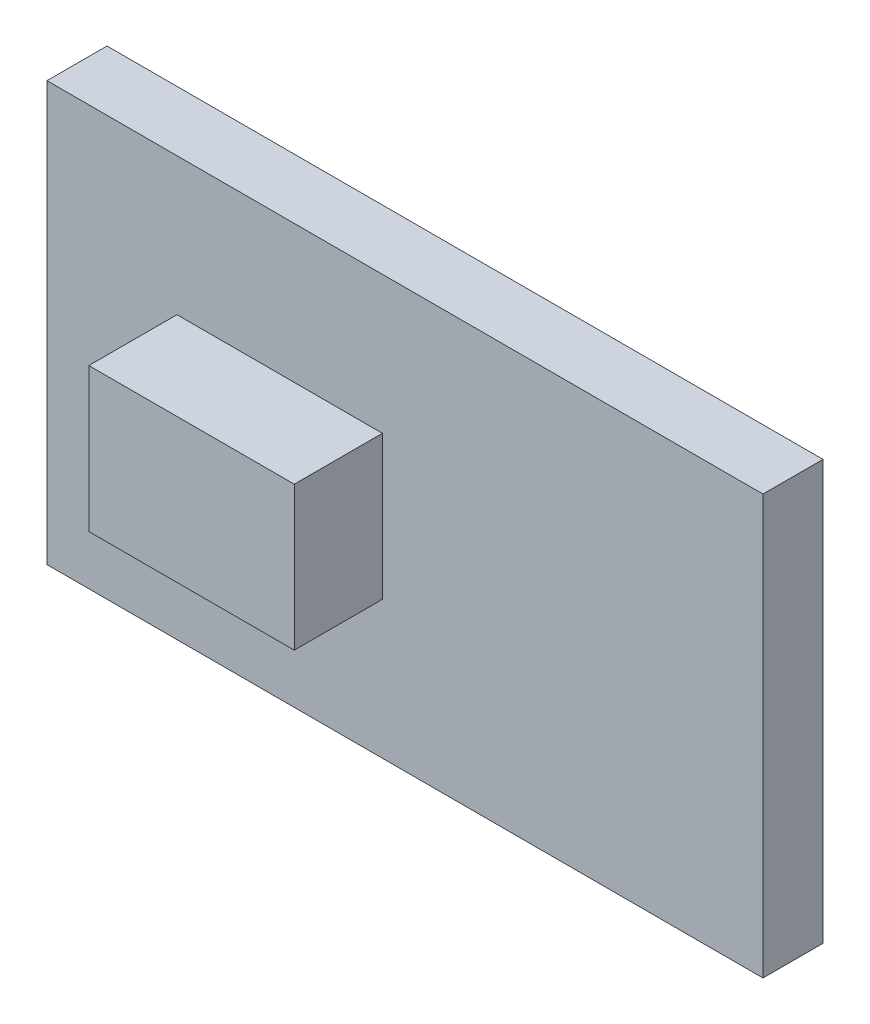
ISO-10303-21;
HEADER;
FILE_DESCRIPTION(('STEP AP214'),'2;1');
FILE_NAME('part.step','',(''),(''),'','','');
FILE_SCHEMA(('AUTOMOTIVE_DESIGN { 1 0 10303 214 1 1 1 1 }'));
ENDSEC;
DATA;
#1=APPLICATION_CONTEXT('core data for automotive mechanical design processes');
#2=APPLICATION_PROTOCOL_DEFINITION('international standard','automotive_design',2000,#1);
#3=PRODUCT_CONTEXT('',#1,'mechanical');
#4=PRODUCT('Part','Part','',(#3));
#5=PRODUCT_RELATED_PRODUCT_CATEGORY('part','',(#4));
#6=PRODUCT_DEFINITION_FORMATION('','',#4);
#7=PRODUCT_DEFINITION_CONTEXT('part definition',#1,'design');
#8=PRODUCT_DEFINITION('design','',#6,#7);
#9=PRODUCT_DEFINITION_SHAPE('','',#8);
#10=(LENGTH_UNIT() NAMED_UNIT(*) SI_UNIT(.MILLI.,.METRE.));
#11=(NAMED_UNIT(*) PLANE_ANGLE_UNIT() SI_UNIT($,.RADIAN.));
#12=(NAMED_UNIT(*) SI_UNIT($,.STERADIAN.) SOLID_ANGLE_UNIT());
#13=UNCERTAINTY_MEASURE_WITH_UNIT(LENGTH_MEASURE(1.E-05),#10,'distance_accuracy_value','');
#14=(GEOMETRIC_REPRESENTATION_CONTEXT(3) GLOBAL_UNCERTAINTY_ASSIGNED_CONTEXT((#13)) GLOBAL_UNIT_ASSIGNED_CONTEXT((#10,
#11,#12)) REPRESENTATION_CONTEXT('',''));
#15=CARTESIAN_POINT('',(0.,0.,0.));
#16=DIRECTION('',(0.,0.,1.));
#17=DIRECTION('',(1.,0.,0.));
#18=AXIS2_PLACEMENT_3D('',#15,#16,#17);
#19=CARTESIAN_POINT('',(-29.2958267155257,7.61,1.09));
#20=DIRECTION('',(0.,0.,-1.));
#21=DIRECTION('',(-1.,0.,0.));
#22=AXIS2_PLACEMENT_3D('',#19,#20,#21);
#23=PLANE('',#22);
#24=DIRECTION('',(0.,-1.,0.));
#25=VECTOR('',#24,1.);
#26=CARTESIAN_POINT('',(-29.2958267155257,0.,1.09));
#27=LINE('',#26,#25);
#28=CARTESIAN_POINT('',(-29.2958267155257,7.61,1.09));
#29=VERTEX_POINT('',#28);
#30=CARTESIAN_POINT('',(-29.2958267155257,0.,1.09));
#31=VERTEX_POINT('',#30);
#32=EDGE_CURVE('E129',#29,#31,#27,.T.);
#33=ORIENTED_EDGE('',*,*,#32,.T.);
#34=DIRECTION('',(1.,0.,0.));
#35=VECTOR('',#34,1.);
#36=CARTESIAN_POINT('',(-16.2958267155257,0.,1.09));
#37=LINE('',#36,#35);
#38=CARTESIAN_POINT('',(-16.2958267155257,0.,1.09));
#39=VERTEX_POINT('',#38);
#40=EDGE_CURVE('E132',#31,#39,#37,.T.);
#41=ORIENTED_EDGE('',*,*,#40,.T.);
#42=DIRECTION('',(0.,1.,0.));
#43=VECTOR('',#42,1.);
#44=CARTESIAN_POINT('',(-16.2958267155257,7.61,1.09));
#45=LINE('',#44,#43);
#46=CARTESIAN_POINT('',(-16.2958267155257,7.61,1.09));
#47=VERTEX_POINT('',#46);
#48=EDGE_CURVE('E135',#39,#47,#45,.T.);
#49=ORIENTED_EDGE('',*,*,#48,.T.);
#50=DIRECTION('',(-1.,0.,0.));
#51=VECTOR('',#50,1.);
#52=CARTESIAN_POINT('',(-29.2958267155257,7.61,1.09));
#53=LINE('',#52,#51);
#54=EDGE_CURVE('E137',#47,#29,#53,.T.);
#55=ORIENTED_EDGE('',*,*,#54,.T.);
#56=EDGE_LOOP('',(#33,#41,#49,#55));
#57=FACE_BOUND('',#56,.T.);
#58=DIRECTION('',(0.,-1.,0.));
#59=VECTOR('',#58,1.);
#60=CARTESIAN_POINT('',(-26.9358267155257,2.5,1.09));
#61=LINE('',#60,#59);
#62=CARTESIAN_POINT('',(-26.9358267155257,5.11,1.09));
#63=VERTEX_POINT('',#62);
#64=CARTESIAN_POINT('',(-26.9358267155257,2.5,1.09));
#65=VERTEX_POINT('',#64);
#66=EDGE_CURVE('E119',#63,#65,#61,.T.);
#67=ORIENTED_EDGE('',*,*,#66,.F.);
#68=DIRECTION('',(-1.,0.,0.));
#69=VECTOR('',#68,1.);
#70=CARTESIAN_POINT('',(-26.9358267155257,5.11,1.09));
#71=LINE('',#70,#69);
#72=CARTESIAN_POINT('',(-23.2058267155257,5.11,1.09));
#73=VERTEX_POINT('',#72);
#74=EDGE_CURVE('E116',#73,#63,#71,.T.);
#75=ORIENTED_EDGE('',*,*,#74,.F.);
#76=DIRECTION('',(0.,1.,0.));
#77=VECTOR('',#76,1.);
#78=CARTESIAN_POINT('',(-23.2058267155257,5.11,1.09));
#79=LINE('',#78,#77);
#80=CARTESIAN_POINT('',(-23.2058267155257,2.5,1.09));
#81=VERTEX_POINT('',#80);
#82=EDGE_CURVE('E54',#81,#73,#79,.T.);
#83=ORIENTED_EDGE('',*,*,#82,.F.);
#84=DIRECTION('',(1.,0.,0.));
#85=VECTOR('',#84,1.);
#86=CARTESIAN_POINT('',(-23.2058267155257,2.5,1.09));
#87=LINE('',#86,#85);
#88=EDGE_CURVE('E49',#65,#81,#87,.T.);
#89=ORIENTED_EDGE('',*,*,#88,.F.);
#90=EDGE_LOOP('',(#67,#75,#83,#89));
#91=FACE_BOUND('',#90,.T.);
#92=ADVANCED_FACE('F34',(#57,#91),#23,.F.);
#93=CARTESIAN_POINT('',(-29.2958267155257,0.,1.09));
#94=DIRECTION('',(1.,0.,0.));
#95=DIRECTION('',(0.,0.,-1.));
#96=AXIS2_PLACEMENT_3D('',#93,#94,#95);
#97=PLANE('',#96);
#98=DIRECTION('',(0.,-1.,0.));
#99=VECTOR('',#98,1.);
#100=CARTESIAN_POINT('',(-29.2958267155257,0.,0.));
#101=LINE('',#100,#99);
#102=CARTESIAN_POINT('',(-29.2958267155257,7.61,0.));
#103=VERTEX_POINT('',#102);
#104=CARTESIAN_POINT('',(-29.2958267155257,0.,0.));
#105=VERTEX_POINT('',#104);
#106=EDGE_CURVE('E120',#103,#105,#101,.T.);
#107=ORIENTED_EDGE('',*,*,#106,.T.);
#108=DIRECTION('',(0.,0.,-1.));
#109=VECTOR('',#108,1.);
#110=CARTESIAN_POINT('',(-29.2958267155257,0.,1.09));
#111=LINE('',#110,#109);
#112=EDGE_CURVE('E11',#31,#105,#111,.T.);
#113=ORIENTED_EDGE('',*,*,#112,.F.);
#114=ORIENTED_EDGE('',*,*,#32,.F.);
#115=DIRECTION('',(0.,0.,-1.));
#116=VECTOR('',#115,1.);
#117=CARTESIAN_POINT('',(-29.2958267155257,7.61,1.09));
#118=LINE('',#117,#116);
#119=EDGE_CURVE('E138',#29,#103,#118,.T.);
#120=ORIENTED_EDGE('',*,*,#119,.T.);
#121=EDGE_LOOP('',(#107,#113,#114,#120));
#122=FACE_BOUND('',#121,.T.);
#123=ADVANCED_FACE('F36',(#122),#97,.F.);
#124=CARTESIAN_POINT('',(-16.2958267155257,0.,1.09));
#125=DIRECTION('',(0.,1.,0.));
#126=DIRECTION('',(0.,0.,1.));
#127=AXIS2_PLACEMENT_3D('',#124,#125,#126);
#128=PLANE('',#127);
#129=DIRECTION('',(1.,0.,0.));
#130=VECTOR('',#129,1.);
#131=CARTESIAN_POINT('',(-16.2958267155257,0.,0.));
#132=LINE('',#131,#130);
#133=CARTESIAN_POINT('',(-16.2958267155257,0.,0.));
#134=VERTEX_POINT('',#133);
#135=EDGE_CURVE('E123',#105,#134,#132,.T.);
#136=ORIENTED_EDGE('',*,*,#135,.T.);
#137=DIRECTION('',(0.,0.,-1.));
#138=VECTOR('',#137,1.);
#139=CARTESIAN_POINT('',(-16.2958267155257,0.,1.09));
#140=LINE('',#139,#138);
#141=EDGE_CURVE('E42',#39,#134,#140,.T.);
#142=ORIENTED_EDGE('',*,*,#141,.F.);
#143=ORIENTED_EDGE('',*,*,#40,.F.);
#144=ORIENTED_EDGE('',*,*,#112,.T.);
#145=EDGE_LOOP('',(#136,#142,#143,#144));
#146=FACE_BOUND('',#145,.T.);
#147=ADVANCED_FACE('F168',(#146),#128,.F.);
#148=CARTESIAN_POINT('',(-16.2958267155257,7.61,1.09));
#149=DIRECTION('',(-1.,0.,0.));
#150=DIRECTION('',(0.,0.,1.));
#151=AXIS2_PLACEMENT_3D('',#148,#149,#150);
#152=PLANE('',#151);
#153=DIRECTION('',(0.,1.,0.));
#154=VECTOR('',#153,1.);
#155=CARTESIAN_POINT('',(-16.2958267155257,7.61,0.));
#156=LINE('',#155,#154);
#157=CARTESIAN_POINT('',(-16.2958267155257,7.61,0.));
#158=VERTEX_POINT('',#157);
#159=EDGE_CURVE('E141',#134,#158,#156,.T.);
#160=ORIENTED_EDGE('',*,*,#159,.T.);
#161=DIRECTION('',(0.,0.,-1.));
#162=VECTOR('',#161,1.);
#163=CARTESIAN_POINT('',(-16.2958267155257,7.61,1.09));
#164=LINE('',#163,#162);
#165=EDGE_CURVE('E146',#47,#158,#164,.T.);
#166=ORIENTED_EDGE('',*,*,#165,.F.);
#167=ORIENTED_EDGE('',*,*,#48,.F.);
#168=ORIENTED_EDGE('',*,*,#141,.T.);
#169=EDGE_LOOP('',(#160,#166,#167,#168));
#170=FACE_BOUND('',#169,.T.);
#171=ADVANCED_FACE('F153',(#170),#152,.F.);
#172=CARTESIAN_POINT('',(-29.2958267155257,7.61,1.09));
#173=DIRECTION('',(0.,-1.,0.));
#174=DIRECTION('',(0.,0.,-1.));
#175=AXIS2_PLACEMENT_3D('',#172,#173,#174);
#176=PLANE('',#175);
#177=DIRECTION('',(-1.,0.,0.));
#178=VECTOR('',#177,1.);
#179=CARTESIAN_POINT('',(-29.2958267155257,7.61,0.));
#180=LINE('',#179,#178);
#181=EDGE_CURVE('E133',#158,#103,#180,.T.);
#182=ORIENTED_EDGE('',*,*,#181,.T.);
#183=ORIENTED_EDGE('',*,*,#119,.F.);
#184=ORIENTED_EDGE('',*,*,#54,.F.);
#185=ORIENTED_EDGE('',*,*,#165,.T.);
#186=EDGE_LOOP('',(#182,#183,#184,#185));
#187=FACE_BOUND('',#186,.T.);
#188=ADVANCED_FACE('F162',(#187),#176,.F.);
#189=CARTESIAN_POINT('',(-29.2958267155257,7.61,0.));
#190=DIRECTION('',(0.,0.,-1.));
#191=DIRECTION('',(-1.,0.,0.));
#192=AXIS2_PLACEMENT_3D('',#189,#190,#191);
#193=PLANE('',#192);
#194=ORIENTED_EDGE('',*,*,#106,.F.);
#195=ORIENTED_EDGE('',*,*,#181,.F.);
#196=ORIENTED_EDGE('',*,*,#159,.F.);
#197=ORIENTED_EDGE('',*,*,#135,.F.);
#198=EDGE_LOOP('',(#194,#195,#196,#197));
#199=FACE_BOUND('',#198,.T.);
#200=ADVANCED_FACE('F159',(#199),#193,.T.);
#201=CARTESIAN_POINT('',(-26.9358267155257,2.5,2.69));
#202=DIRECTION('',(1.,0.,0.));
#203=DIRECTION('',(0.,0.,-1.));
#204=AXIS2_PLACEMENT_3D('',#201,#202,#203);
#205=PLANE('',#204);
#206=ORIENTED_EDGE('',*,*,#66,.T.);
#207=DIRECTION('',(0.,0.,-1.));
#208=VECTOR('',#207,1.);
#209=CARTESIAN_POINT('',(-26.9358267155257,2.5,2.69));
#210=LINE('',#209,#208);
#211=CARTESIAN_POINT('',(-26.9358267155257,2.5,2.69));
#212=VERTEX_POINT('',#211);
#213=EDGE_CURVE('E100',#212,#65,#210,.T.);
#214=ORIENTED_EDGE('',*,*,#213,.F.);
#215=DIRECTION('',(0.,-1.,0.));
#216=VECTOR('',#215,1.);
#217=CARTESIAN_POINT('',(-26.9358267155257,2.5,2.69));
#218=LINE('',#217,#216);
#219=CARTESIAN_POINT('',(-26.9358267155257,5.11,2.69));
#220=VERTEX_POINT('',#219);
#221=EDGE_CURVE('E107',#220,#212,#218,.T.);
#222=ORIENTED_EDGE('',*,*,#221,.F.);
#223=DIRECTION('',(0.,0.,-1.));
#224=VECTOR('',#223,1.);
#225=CARTESIAN_POINT('',(-26.9358267155257,5.11,2.69));
#226=LINE('',#225,#224);
#227=EDGE_CURVE('E283',#220,#63,#226,.T.);
#228=ORIENTED_EDGE('',*,*,#227,.T.);
#229=EDGE_LOOP('',(#206,#214,#222,#228));
#230=FACE_BOUND('',#229,.T.);
#231=ADVANCED_FACE('F118',(#230),#205,.F.);
#232=CARTESIAN_POINT('',(-23.2058267155257,2.5,2.69));
#233=DIRECTION('',(0.,1.,0.));
#234=DIRECTION('',(-1.,0.,0.));
#235=AXIS2_PLACEMENT_3D('',#232,#233,#234);
#236=PLANE('',#235);
#237=ORIENTED_EDGE('',*,*,#88,.T.);
#238=DIRECTION('',(0.,0.,-1.));
#239=VECTOR('',#238,1.);
#240=CARTESIAN_POINT('',(-23.2058267155257,2.5,2.69));
#241=LINE('',#240,#239);
#242=CARTESIAN_POINT('',(-23.2058267155257,2.5,2.69));
#243=VERTEX_POINT('',#242);
#244=EDGE_CURVE('E103',#243,#81,#241,.T.);
#245=ORIENTED_EDGE('',*,*,#244,.F.);
#246=DIRECTION('',(1.,0.,0.));
#247=VECTOR('',#246,1.);
#248=CARTESIAN_POINT('',(-23.2058267155257,2.5,2.69));
#249=LINE('',#248,#247);
#250=EDGE_CURVE('E96',#212,#243,#249,.T.);
#251=ORIENTED_EDGE('',*,*,#250,.F.);
#252=ORIENTED_EDGE('',*,*,#213,.T.);
#253=EDGE_LOOP('',(#237,#245,#251,#252));
#254=FACE_BOUND('',#253,.T.);
#255=ADVANCED_FACE('F98',(#254),#236,.F.);
#256=CARTESIAN_POINT('',(-23.2058267155257,5.11,2.69));
#257=DIRECTION('',(-1.,0.,0.));
#258=DIRECTION('',(0.,0.,1.));
#259=AXIS2_PLACEMENT_3D('',#256,#257,#258);
#260=PLANE('',#259);
#261=ORIENTED_EDGE('',*,*,#82,.T.);
#262=DIRECTION('',(0.,0.,-1.));
#263=VECTOR('',#262,1.);
#264=CARTESIAN_POINT('',(-23.2058267155257,5.11,2.69));
#265=LINE('',#264,#263);
#266=CARTESIAN_POINT('',(-23.2058267155257,5.11,2.69));
#267=VERTEX_POINT('',#266);
#268=EDGE_CURVE('E125',#267,#73,#265,.T.);
#269=ORIENTED_EDGE('',*,*,#268,.F.);
#270=DIRECTION('',(0.,1.,0.));
#271=VECTOR('',#270,1.);
#272=CARTESIAN_POINT('',(-23.2058267155257,5.11,2.69));
#273=LINE('',#272,#271);
#274=EDGE_CURVE('E106',#243,#267,#273,.T.);
#275=ORIENTED_EDGE('',*,*,#274,.F.);
#276=ORIENTED_EDGE('',*,*,#244,.T.);
#277=EDGE_LOOP('',(#261,#269,#275,#276));
#278=FACE_BOUND('',#277,.T.);
#279=ADVANCED_FACE('F206',(#278),#260,.F.);
#280=CARTESIAN_POINT('',(-26.9358267155257,5.11,2.69));
#281=DIRECTION('',(0.,-1.,0.));
#282=DIRECTION('',(0.,0.,-1.));
#283=AXIS2_PLACEMENT_3D('',#280,#281,#282);
#284=PLANE('',#283);
#285=ORIENTED_EDGE('',*,*,#74,.T.);
#286=ORIENTED_EDGE('',*,*,#227,.F.);
#287=DIRECTION('',(-1.,0.,0.));
#288=VECTOR('',#287,1.);
#289=CARTESIAN_POINT('',(-26.9358267155257,5.11,2.69));
#290=LINE('',#289,#288);
#291=EDGE_CURVE('E112',#267,#220,#290,.T.);
#292=ORIENTED_EDGE('',*,*,#291,.F.);
#293=ORIENTED_EDGE('',*,*,#268,.T.);
#294=EDGE_LOOP('',(#285,#286,#292,#293));
#295=FACE_BOUND('',#294,.T.);
#296=ADVANCED_FACE('F211',(#295),#284,.F.);
#297=CARTESIAN_POINT('',(-26.9358267155257,5.11,2.69));
#298=DIRECTION('',(0.,0.,-1.));
#299=DIRECTION('',(-1.,0.,0.));
#300=AXIS2_PLACEMENT_3D('',#297,#298,#299);
#301=PLANE('',#300);
#302=ORIENTED_EDGE('',*,*,#221,.T.);
#303=ORIENTED_EDGE('',*,*,#250,.T.);
#304=ORIENTED_EDGE('',*,*,#274,.T.);
#305=ORIENTED_EDGE('',*,*,#291,.T.);
#306=EDGE_LOOP('',(#302,#303,#304,#305));
#307=FACE_BOUND('',#306,.T.);
#308=ADVANCED_FACE('F110',(#307),#301,.F.);
#309=CLOSED_SHELL('',(#92,#123,#147,#171,#188,#200,#231,#255,#279,#296,#308));
#310=MANIFOLD_SOLID_BREP('B2',#309);
#311=ADVANCED_BREP_SHAPE_REPRESENTATION('',(#18,#310),#14);
#312=SHAPE_DEFINITION_REPRESENTATION(#9,#311);
ENDSEC;
END-ISO-10303-21;
